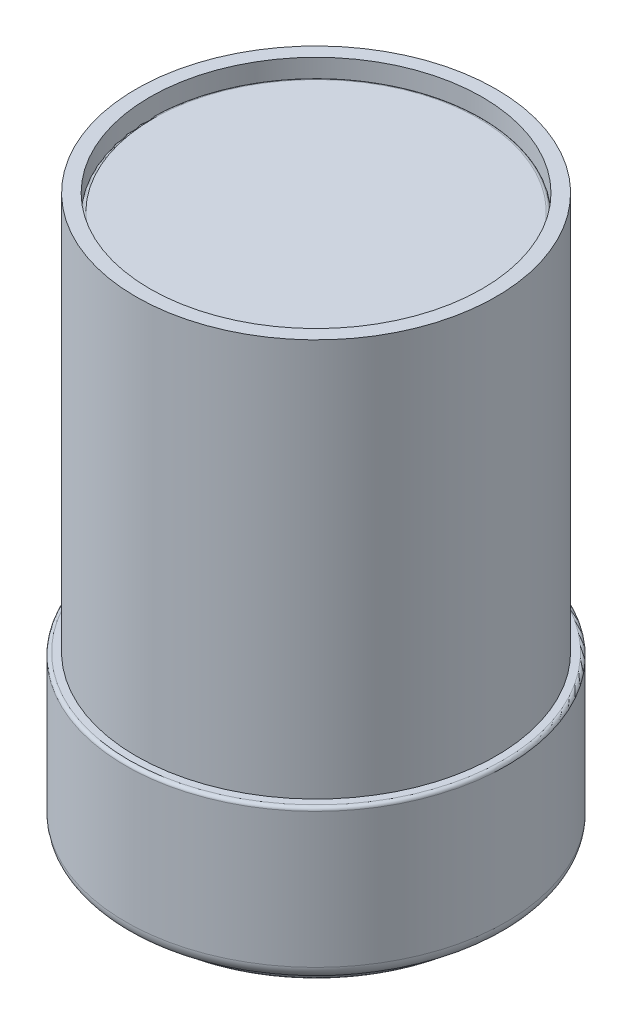
ISO-10303-21;
HEADER;
FILE_DESCRIPTION(('STEP AP214'),'2;1');
FILE_NAME('part.step','',(''),(''),'','','');
FILE_SCHEMA(('AUTOMOTIVE_DESIGN { 1 0 10303 214 1 1 1 1 }'));
ENDSEC;
DATA;
#1=APPLICATION_CONTEXT('core data for automotive mechanical design processes');
#2=APPLICATION_PROTOCOL_DEFINITION('international standard','automotive_design',2000,#1);
#3=PRODUCT_CONTEXT('',#1,'mechanical');
#4=PRODUCT('Part','Part','',(#3));
#5=PRODUCT_RELATED_PRODUCT_CATEGORY('part','',(#4));
#6=PRODUCT_DEFINITION_FORMATION('','',#4);
#7=PRODUCT_DEFINITION_CONTEXT('part definition',#1,'design');
#8=PRODUCT_DEFINITION('design','',#6,#7);
#9=PRODUCT_DEFINITION_SHAPE('','',#8);
#10=(LENGTH_UNIT() NAMED_UNIT(*) SI_UNIT(.MILLI.,.METRE.));
#11=(NAMED_UNIT(*) PLANE_ANGLE_UNIT() SI_UNIT($,.RADIAN.));
#12=(NAMED_UNIT(*) SI_UNIT($,.STERADIAN.) SOLID_ANGLE_UNIT());
#13=UNCERTAINTY_MEASURE_WITH_UNIT(LENGTH_MEASURE(1.E-05),#10,'distance_accuracy_value','');
#14=(GEOMETRIC_REPRESENTATION_CONTEXT(3) GLOBAL_UNCERTAINTY_ASSIGNED_CONTEXT((#13)) GLOBAL_UNIT_ASSIGNED_CONTEXT((#10,
#11,#12)) REPRESENTATION_CONTEXT('',''));
#15=CARTESIAN_POINT('',(0.,0.,0.));
#16=DIRECTION('',(0.,0.,1.));
#17=DIRECTION('',(1.,0.,0.));
#18=AXIS2_PLACEMENT_3D('',#15,#16,#17);
#19=CARTESIAN_POINT('',(0.,161.925,0.));
#20=DIRECTION('',(0.,-1.,0.));
#21=DIRECTION('',(0.,0.,-1.));
#22=AXIS2_PLACEMENT_3D('',#19,#20,#21);
#23=CYLINDRICAL_SURFACE('',#22,76.2);
#24=CARTESIAN_POINT('',(0.,160.401,0.));
#25=DIRECTION('',(0.,1.,0.));
#26=DIRECTION('',(0.,0.,1.));
#27=AXIS2_PLACEMENT_3D('',#24,#25,#26);
#28=CIRCLE('',#27,76.2);
#29=CARTESIAN_POINT('',(0.,160.401,-76.2));
#30=VERTEX_POINT('',#29);
#31=EDGE_CURVE('E11',#30,#30,#28,.F.);
#32=CARTESIAN_POINT('',(0.,-63.5000000000001,0.));
#33=DIRECTION('',(0.,1.,0.));
#34=DIRECTION('',(0.,0.,1.));
#35=AXIS2_PLACEMENT_3D('',#32,#33,#34);
#36=CIRCLE('',#35,76.2);
#37=CARTESIAN_POINT('',(0.,-63.5000000000001,-76.2));
#38=VERTEX_POINT('',#37);
#39=EDGE_CURVE('E53',#38,#38,#36,.T.);
#40=CARTESIAN_POINT('',(0.,160.401,-76.2));
#41=CARTESIAN_POINT('',(0.,158.068697916666,-76.2));
#42=CARTESIAN_POINT('',(0.,155.736395833333,-76.2));
#43=CARTESIAN_POINT('',(0.,151.071791666666,-76.2));
#44=CARTESIAN_POINT('',(0.,148.739489583333,-76.2));
#45=CARTESIAN_POINT('',(0.,144.074885416666,-76.2));
#46=CARTESIAN_POINT('',(0.,141.742583333333,-76.2));
#47=CARTESIAN_POINT('',(0.,137.077979166666,-76.2));
#48=CARTESIAN_POINT('',(0.,134.745677083333,-76.2));
#49=CARTESIAN_POINT('',(0.,130.081072916666,-76.2));
#50=CARTESIAN_POINT('',(0.,127.748770833333,-76.2));
#51=CARTESIAN_POINT('',(0.,123.084166666666,-76.2));
#52=CARTESIAN_POINT('',(0.,120.751864583333,-76.2));
#53=CARTESIAN_POINT('',(0.,116.087260416666,-76.2));
#54=CARTESIAN_POINT('',(0.,113.754958333333,-76.2));
#55=CARTESIAN_POINT('',(0.,109.090354166666,-76.2));
#56=CARTESIAN_POINT('',(0.,106.758052083333,-76.2));
#57=CARTESIAN_POINT('',(0.,102.093447916666,-76.2));
#58=CARTESIAN_POINT('',(0.,99.761145833333,-76.2));
#59=CARTESIAN_POINT('',(0.,95.0965416666663,-76.2));
#60=CARTESIAN_POINT('',(0.,92.764239583333,-76.2));
#61=CARTESIAN_POINT('',(0.,88.0996354166663,-76.2));
#62=CARTESIAN_POINT('',(0.,85.767333333333,-76.2));
#63=CARTESIAN_POINT('',(0.,81.1027291666664,-76.2));
#64=CARTESIAN_POINT('',(0.,78.770427083333,-76.2));
#65=CARTESIAN_POINT('',(0.,74.1058229166664,-76.2));
#66=CARTESIAN_POINT('',(0.,71.773520833333,-76.2));
#67=CARTESIAN_POINT('',(0.,67.1089166666664,-76.2));
#68=CARTESIAN_POINT('',(0.,64.776614583333,-76.2));
#69=CARTESIAN_POINT('',(0.,60.1120104166664,-76.2));
#70=CARTESIAN_POINT('',(0.,57.779708333333,-76.2));
#71=CARTESIAN_POINT('',(0.,53.1151041666664,-76.2));
#72=CARTESIAN_POINT('',(0.,50.7828020833331,-76.2));
#73=CARTESIAN_POINT('',(0.,46.1181979166664,-76.2));
#74=CARTESIAN_POINT('',(0.,43.7858958333331,-76.2));
#75=CARTESIAN_POINT('',(0.,39.1212916666664,-76.2));
#76=CARTESIAN_POINT('',(0.,36.7889895833331,-76.2));
#77=CARTESIAN_POINT('',(0.,32.1243854166664,-76.2));
#78=CARTESIAN_POINT('',(0.,29.7920833333331,-76.2));
#79=CARTESIAN_POINT('',(0.,25.1274791666665,-76.2));
#80=CARTESIAN_POINT('',(0.,22.7951770833331,-76.2));
#81=CARTESIAN_POINT('',(0.,18.1305729166665,-76.2));
#82=CARTESIAN_POINT('',(0.,15.7982708333331,-76.2));
#83=CARTESIAN_POINT('',(0.,11.1336666666665,-76.2));
#84=CARTESIAN_POINT('',(0.,8.80136458333315,-76.2));
#85=CARTESIAN_POINT('',(0.,4.13676041666649,-76.2));
#86=CARTESIAN_POINT('',(0.,1.80445833333316,-76.2));
#87=CARTESIAN_POINT('',(0.,-2.86014583333352,-76.2));
#88=CARTESIAN_POINT('',(0.,-5.19244791666687,-76.2));
#89=CARTESIAN_POINT('',(0.,-9.85705208333355,-76.2));
#90=CARTESIAN_POINT('',(0.,-12.1893541666669,-76.2));
#91=CARTESIAN_POINT('',(0.,-16.8539583333335,-76.2));
#92=CARTESIAN_POINT('',(0.,-19.1862604166669,-76.2));
#93=CARTESIAN_POINT('',(0.,-23.8508645833335,-76.2));
#94=CARTESIAN_POINT('',(0.,-26.1831666666669,-76.2));
#95=CARTESIAN_POINT('',(0.,-30.8477708333335,-76.2));
#96=CARTESIAN_POINT('',(0.,-33.1800729166669,-76.2));
#97=CARTESIAN_POINT('',(0.,-37.8446770833335,-76.2));
#98=CARTESIAN_POINT('',(0.,-40.1769791666668,-76.2));
#99=CARTESIAN_POINT('',(0.,-44.8415833333335,-76.2));
#100=CARTESIAN_POINT('',(0.,-47.1738854166668,-76.2));
#101=CARTESIAN_POINT('',(0.,-51.8384895833335,-76.2));
#102=CARTESIAN_POINT('',(0.,-54.1707916666668,-76.2));
#103=CARTESIAN_POINT('',(0.,-58.8353958333335,-76.2));
#104=CARTESIAN_POINT('',(0.,-61.1676979166668,-76.2));
#105=CARTESIAN_POINT('',(0.,-63.5000000000001,-76.2));
#106=B_SPLINE_CURVE_WITH_KNOTS('',3,(#40,#41,#42,#43,#44,#45,#46,#47,#48,#49,#50,#51,#52,#53,
#54,#55,#56,#57,#58,#59,#60,#61,#62,#63,#64,#65,#66,#67,#68,#69,#70,#71,#72,#73,#74,#75,#76,#77,
#78,#79,#80,#81,#82,#83,#84,#85,#86,#87,#88,#89,#90,#91,#92,#93,#94,#95,#96,#97,#98,#99,#100,
#101,#102,#103,#104,#105),.UNSPECIFIED.,.F.,.F.,(4,2,2,2,2,2,2,2,2,2,2,2,2,2,2,2,2,2,2,2,2,2,2,
2,2,2,2,2,2,2,2,2,4),(0.,6.99690625000002,13.9938125,20.99071875,27.987625,34.98453125,
41.9814375,48.97834375,55.9752499999999,62.9721562499999,69.9690624999999,76.9659687499999,
83.9628749999999,90.9597812499999,97.9566874999999,104.95359375,111.9505,118.94740625,
125.9443125,132.94121875,139.938125,146.93503125,153.9319375,160.92884375,167.92575,
174.92265625,181.9195625,188.91646875,195.913375,202.91028125,209.9071875,216.90409375,223.901),.UNSPECIFIED.);
#107=EDGE_CURVE('BSEAM42',#30,#38,#106,.T.);
#108=ORIENTED_EDGE('',*,*,#31,.T.);
#109=ORIENTED_EDGE('',*,*,#39,.T.);
#110=ORIENTED_EDGE('',*,*,#107,.T.);
#111=ORIENTED_EDGE('',*,*,#107,.F.);
#112=EDGE_LOOP('',(#108,#110,#109,#111));
#113=FACE_BOUND('',#112,.T.);
#114=ADVANCED_FACE('F42',(#113),#23,.T.);
#115=CARTESIAN_POINT('',(0.,161.925,0.));
#116=DIRECTION('',(0.,1.,0.));
#117=DIRECTION('',(0.,0.,1.));
#118=AXIS2_PLACEMENT_3D('',#115,#116,#117);
#119=PLANE('',#118);
#120=CARTESIAN_POINT('',(0.,161.925,0.));
#121=DIRECTION('',(0.,1.,0.));
#122=DIRECTION('',(0.,0.,1.));
#123=AXIS2_PLACEMENT_3D('',#120,#121,#122);
#124=CIRCLE('',#123,74.676);
#125=CARTESIAN_POINT('',(0.,161.925,74.676));
#126=VERTEX_POINT('',#125);
#127=EDGE_CURVE('E49',#126,#126,#124,.T.);
#128=ORIENTED_EDGE('',*,*,#127,.T.);
#129=EDGE_LOOP('',(#128));
#130=FACE_BOUND('',#129,.T.);
#131=ADVANCED_FACE('F63',(#130),#119,.T.);
#132=CARTESIAN_POINT('',(0.,-63.5000000000001,0.));
#133=DIRECTION('',(0.,1.,0.));
#134=DIRECTION('',(0.,0.,1.));
#135=AXIS2_PLACEMENT_3D('',#132,#133,#134);
#136=PLANE('',#135);
#137=ORIENTED_EDGE('',*,*,#39,.F.);
#138=EDGE_LOOP('',(#137));
#139=FACE_BOUND('',#138,.T.);
#140=ADVANCED_FACE('F61',(#139),#136,.F.);
#141=CARTESIAN_POINT('',(0.,160.401,0.));
#142=DIRECTION('',(0.,1.,0.));
#143=DIRECTION('',(0.,0.,1.));
#144=AXIS2_PLACEMENT_3D('',#141,#142,#143);
#145=TOROIDAL_SURFACE('',#144,74.676,1.52399999999999);
#146=ORIENTED_EDGE('',*,*,#31,.F.);
#147=EDGE_LOOP('',(#146));
#148=FACE_BOUND('',#147,.T.);
#149=ORIENTED_EDGE('',*,*,#127,.F.);
#150=EDGE_LOOP('',(#149));
#151=FACE_BOUND('',#150,.T.);
#152=ADVANCED_FACE('F44',(#148,#151),#145,.T.);
#153=CLOSED_SHELL('',(#114,#131,#140,#152));
#154=MANIFOLD_SOLID_BREP('B2',#153);
#155=CARTESIAN_POINT('',(0.,-12.7,0.));
#156=DIRECTION('',(0.,-1.,0.));
#157=DIRECTION('',(0.,0.,-1.));
#158=AXIS2_PLACEMENT_3D('',#155,#156,#157);
#159=CYLINDRICAL_SURFACE('',#158,87.3125);
#160=CARTESIAN_POINT('',(0.,-76.2000000000001,0.));
#161=DIRECTION('',(0.,-1.,0.));
#162=DIRECTION('',(0.,0.,-1.));
#163=AXIS2_PLACEMENT_3D('',#160,#161,#162);
#164=CIRCLE('',#163,87.3125);
#165=CARTESIAN_POINT('',(0.,-76.2000000000001,-87.3125));
#166=VERTEX_POINT('',#165);
#167=EDGE_CURVE('E131',#166,#166,#164,.F.);
#168=ORIENTED_EDGE('',*,*,#167,.T.);
#169=EDGE_LOOP('',(#168));
#170=FACE_BOUND('',#169,.T.);
#171=CARTESIAN_POINT('',(0.,-14.224,0.));
#172=DIRECTION('',(0.,-1.,0.));
#173=DIRECTION('',(0.,0.,-1.));
#174=AXIS2_PLACEMENT_3D('',#171,#172,#173);
#175=CIRCLE('',#174,87.3125);
#176=CARTESIAN_POINT('',(0.,-14.224,-87.3125));
#177=VERTEX_POINT('',#176);
#178=EDGE_CURVE('E143',#177,#177,#175,.T.);
#179=ORIENTED_EDGE('',*,*,#178,.T.);
#180=EDGE_LOOP('',(#179));
#181=FACE_BOUND('',#180,.T.);
#182=ADVANCED_FACE('F105',(#170,#181),#159,.T.);
#183=CARTESIAN_POINT('',(0.,-12.7,0.));
#184=DIRECTION('',(0.,-1.,0.));
#185=DIRECTION('',(0.,0.,-1.));
#186=AXIS2_PLACEMENT_3D('',#183,#184,#185);
#187=PLANE('',#186);
#188=CARTESIAN_POINT('',(0.,-12.7,0.));
#189=DIRECTION('',(0.,-1.,0.));
#190=DIRECTION('',(0.,0.,-1.));
#191=AXIS2_PLACEMENT_3D('',#188,#189,#190);
#192=CIRCLE('',#191,85.7885);
#193=CARTESIAN_POINT('',(0.,-12.7,-85.7885));
#194=VERTEX_POINT('',#193);
#195=EDGE_CURVE('E137',#194,#194,#192,.F.);
#196=ORIENTED_EDGE('',*,*,#195,.T.);
#197=EDGE_LOOP('',(#196));
#198=FACE_BOUND('',#197,.T.);
#199=CARTESIAN_POINT('',(0.,-12.7,0.));
#200=DIRECTION('',(0.,-1.,0.));
#201=DIRECTION('',(0.,0.,-1.));
#202=AXIS2_PLACEMENT_3D('',#199,#200,#201);
#203=CIRCLE('',#202,82.4865);
#204=CARTESIAN_POINT('',(0.,-12.7,-82.4865));
#205=VERTEX_POINT('',#204);
#206=EDGE_CURVE('E140',#205,#205,#203,.T.);
#207=ORIENTED_EDGE('',*,*,#206,.T.);
#208=EDGE_LOOP('',(#207));
#209=FACE_BOUND('',#208,.T.);
#210=ADVANCED_FACE('F163',(#198,#209),#187,.F.);
#211=CARTESIAN_POINT('',(0.,-12.7,0.));
#212=DIRECTION('',(0.,-1.,0.));
#213=DIRECTION('',(0.,0.,-1.));
#214=AXIS2_PLACEMENT_3D('',#211,#212,#213);
#215=CYLINDRICAL_SURFACE('',#214,80.9625);
#216=CARTESIAN_POINT('',(0.,-14.224,0.));
#217=DIRECTION('',(0.,-1.,0.));
#218=DIRECTION('',(0.,0.,-1.));
#219=AXIS2_PLACEMENT_3D('',#216,#217,#218);
#220=CIRCLE('',#219,80.9625);
#221=CARTESIAN_POINT('',(0.,-14.224,-80.9625));
#222=VERTEX_POINT('',#221);
#223=EDGE_CURVE('E134',#222,#222,#220,.F.);
#224=ORIENTED_EDGE('',*,*,#223,.T.);
#225=EDGE_LOOP('',(#224));
#226=FACE_BOUND('',#225,.T.);
#227=CARTESIAN_POINT('',(0.,-76.2000000000001,0.));
#228=DIRECTION('',(0.,-1.,0.));
#229=DIRECTION('',(0.,0.,-1.));
#230=AXIS2_PLACEMENT_3D('',#227,#228,#229);
#231=CIRCLE('',#230,80.9625);
#232=CARTESIAN_POINT('',(0.,-76.2000000000001,-80.9625));
#233=VERTEX_POINT('',#232);
#234=EDGE_CURVE('E146',#233,#233,#231,.T.);
#235=ORIENTED_EDGE('',*,*,#234,.T.);
#236=EDGE_LOOP('',(#235));
#237=FACE_BOUND('',#236,.T.);
#238=ADVANCED_FACE('F150',(#226,#237),#215,.F.);
#239=CARTESIAN_POINT('',(0.,-76.2000000000001,0.));
#240=DIRECTION('',(0.,-1.,0.));
#241=DIRECTION('',(0.,0.,-1.));
#242=AXIS2_PLACEMENT_3D('',#239,#240,#241);
#243=PLANE('',#242);
#244=ORIENTED_EDGE('',*,*,#234,.F.);
#245=EDGE_LOOP('',(#244));
#246=FACE_BOUND('',#245,.T.);
#247=ADVANCED_FACE('F152',(#246),#243,.F.);
#248=CARTESIAN_POINT('',(0.,-14.224,0.));
#249=DIRECTION('',(0.,-1.,0.));
#250=DIRECTION('',(0.,0.,-1.));
#251=AXIS2_PLACEMENT_3D('',#248,#249,#250);
#252=TOROIDAL_SURFACE('',#251,85.7885,1.524);
#253=ORIENTED_EDGE('',*,*,#195,.F.);
#254=EDGE_LOOP('',(#253));
#255=FACE_BOUND('',#254,.T.);
#256=ORIENTED_EDGE('',*,*,#178,.F.);
#257=EDGE_LOOP('',(#256));
#258=FACE_BOUND('',#257,.T.);
#259=ADVANCED_FACE('F154',(#255,#258),#252,.T.);
#260=CARTESIAN_POINT('',(0.,-14.224,0.));
#261=DIRECTION('',(0.,-1.,0.));
#262=DIRECTION('',(0.,0.,-1.));
#263=AXIS2_PLACEMENT_3D('',#260,#261,#262);
#264=TOROIDAL_SURFACE('',#263,82.4865,1.524);
#265=ORIENTED_EDGE('',*,*,#223,.F.);
#266=EDGE_LOOP('',(#265));
#267=FACE_BOUND('',#266,.T.);
#268=ORIENTED_EDGE('',*,*,#206,.F.);
#269=EDGE_LOOP('',(#268));
#270=FACE_BOUND('',#269,.T.);
#271=ADVANCED_FACE('F160',(#267,#270),#264,.T.);
#272=CARTESIAN_POINT('',(0.,-76.2000000000001,0.));
#273=DIRECTION('',(0.,-1.,0.));
#274=DIRECTION('',(0.,0.,-1.));
#275=AXIS2_PLACEMENT_3D('',#272,#273,#274);
#276=TOROIDAL_SURFACE('',#275,80.9625,6.35);
#277=CARTESIAN_POINT('',(0.,-82.5001953094789,0.));
#278=DIRECTION('',(0.,1.,0.));
#279=DIRECTION('',(0.,0.,1.));
#280=AXIS2_PLACEMENT_3D('',#277,#278,#279);
#281=CIRCLE('',#280,81.7562500000008);
#282=CARTESIAN_POINT('',(0.,-82.5001953094789,81.7562500000008));
#283=VERTEX_POINT('',#282);
#284=EDGE_CURVE('E125',#283,#283,#281,.T.);
#285=ORIENTED_EDGE('',*,*,#284,.T.);
#286=EDGE_LOOP('',(#285));
#287=FACE_BOUND('',#286,.T.);
#288=ORIENTED_EDGE('',*,*,#167,.F.);
#289=EDGE_LOOP('',(#288));
#290=FACE_BOUND('',#289,.T.);
#291=ADVANCED_FACE('F185',(#287,#290),#276,.T.);
#292=CARTESIAN_POINT('',(0.,-88.9000000000001,0.));
#293=DIRECTION('',(0.,-1.,0.));
#294=DIRECTION('',(0.,0.,-1.));
#295=AXIS2_PLACEMENT_3D('',#292,#293,#294);
#296=PLANE('',#295);
#297=CARTESIAN_POINT('',(0.,-88.9000000000001,0.));
#298=DIRECTION('',(0.,-1.,0.));
#299=DIRECTION('',(0.,0.,-1.));
#300=AXIS2_PLACEMENT_3D('',#297,#298,#299);
#301=CIRCLE('',#300,71.374);
#302=CARTESIAN_POINT('',(0.,-88.9000000000001,-71.374));
#303=VERTEX_POINT('',#302);
#304=EDGE_CURVE('E112',#303,#303,#301,.F.);
#305=ORIENTED_EDGE('',*,*,#304,.T.);
#306=EDGE_LOOP('',(#305));
#307=FACE_BOUND('',#306,.T.);
#308=CARTESIAN_POINT('',(0.,-88.9000000000001,0.));
#309=DIRECTION('',(0.,-1.,0.));
#310=DIRECTION('',(0.,0.,-1.));
#311=AXIS2_PLACEMENT_3D('',#308,#309,#310);
#312=CIRCLE('',#311,74.8059062915883);
#313=CARTESIAN_POINT('',(0.,-88.9000000000001,-74.8059062915883));
#314=VERTEX_POINT('',#313);
#315=EDGE_CURVE('E116',#314,#314,#312,.T.);
#316=ORIENTED_EDGE('',*,*,#315,.T.);
#317=EDGE_LOOP('',(#316));
#318=FACE_BOUND('',#317,.T.);
#319=ADVANCED_FACE('F189',(#307,#318),#296,.T.);
#320=CARTESIAN_POINT('',(0.,-88.9000000000001,0.));
#321=DIRECTION('',(0.,1.,0.));
#322=DIRECTION('',(0.,0.,1.));
#323=AXIS2_PLACEMENT_3D('',#320,#321,#322);
#324=CYLINDRICAL_SURFACE('',#323,69.85);
#325=CARTESIAN_POINT('',(0.,-87.3760000000001,0.));
#326=DIRECTION('',(0.,-1.,0.));
#327=DIRECTION('',(0.,0.,-1.));
#328=AXIS2_PLACEMENT_3D('',#325,#326,#327);
#329=CIRCLE('',#328,69.85);
#330=CARTESIAN_POINT('',(0.,-87.3760000000001,-69.85));
#331=VERTEX_POINT('',#330);
#332=EDGE_CURVE('E120',#331,#331,#329,.T.);
#333=ORIENTED_EDGE('',*,*,#332,.T.);
#334=EDGE_LOOP('',(#333));
#335=FACE_BOUND('',#334,.T.);
#336=CARTESIAN_POINT('',(0.,-82.5500000000001,0.));
#337=DIRECTION('',(0.,-1.,0.));
#338=DIRECTION('',(0.,0.,-1.));
#339=AXIS2_PLACEMENT_3D('',#336,#337,#338);
#340=CIRCLE('',#339,69.85);
#341=CARTESIAN_POINT('',(0.,-82.5500000000001,-69.85));
#342=VERTEX_POINT('',#341);
#343=EDGE_CURVE('E128',#342,#342,#340,.F.);
#344=ORIENTED_EDGE('',*,*,#343,.T.);
#345=EDGE_LOOP('',(#344));
#346=FACE_BOUND('',#345,.T.);
#347=ADVANCED_FACE('F180',(#335,#346),#324,.F.);
#348=CARTESIAN_POINT('',(0.,-82.5500000000001,0.));
#349=DIRECTION('',(0.,-1.,0.));
#350=DIRECTION('',(0.,0.,-1.));
#351=AXIS2_PLACEMENT_3D('',#348,#349,#350);
#352=PLANE('',#351);
#353=ORIENTED_EDGE('',*,*,#343,.F.);
#354=EDGE_LOOP('',(#353));
#355=FACE_BOUND('',#354,.T.);
#356=ADVANCED_FACE('F177',(#355),#352,.T.);
#357=CARTESIAN_POINT('',(0.,-88.8003906189452,0.));
#358=DIRECTION('',(0.,-1.,0.));
#359=DIRECTION('',(0.,0.,-1.));
#360=AXIS2_PLACEMENT_3D('',#357,#358,#359);
#361=TOROIDAL_SURFACE('',#360,82.55,6.35);
#362=CARTESIAN_POINT('',(0.,-87.6516885068927,0.));
#363=DIRECTION('',(0.,-1.,0.));
#364=DIRECTION('',(0.,0.,-1.));
#365=AXIS2_PLACEMENT_3D('',#362,#363,#364);
#366=CIRCLE('',#365,76.3047631383779);
#367=CARTESIAN_POINT('',(0.,-87.6516885068927,-76.3047631383779));
#368=VERTEX_POINT('',#367);
#369=EDGE_CURVE('E41',#368,#368,#366,.F.);
#370=ORIENTED_EDGE('',*,*,#369,.T.);
#371=EDGE_LOOP('',(#370));
#372=FACE_BOUND('',#371,.T.);
#373=ORIENTED_EDGE('',*,*,#284,.F.);
#374=EDGE_LOOP('',(#373));
#375=FACE_BOUND('',#374,.T.);
#376=ADVANCED_FACE('F179',(#372,#375),#361,.F.);
#377=CARTESIAN_POINT('',(0.,-87.3760000000001,0.));
#378=DIRECTION('',(0.,-1.,0.));
#379=DIRECTION('',(0.,0.,-1.));
#380=AXIS2_PLACEMENT_3D('',#377,#378,#379);
#381=TOROIDAL_SURFACE('',#380,71.374,1.524);
#382=ORIENTED_EDGE('',*,*,#304,.F.);
#383=EDGE_LOOP('',(#382));
#384=FACE_BOUND('',#383,.T.);
#385=ORIENTED_EDGE('',*,*,#332,.F.);
#386=EDGE_LOOP('',(#385));
#387=FACE_BOUND('',#386,.T.);
#388=ADVANCED_FACE('F192',(#384,#387),#381,.T.);
#389=CARTESIAN_POINT('',(0.,-87.3760000000001,0.));
#390=DIRECTION('',(0.,1.,0.));
#391=DIRECTION('',(0.,0.,1.));
#392=AXIS2_PLACEMENT_3D('',#389,#390,#391);
#393=TOROIDAL_SURFACE('',#392,74.8059062915883,1.524);
#394=ORIENTED_EDGE('',*,*,#369,.F.);
#395=EDGE_LOOP('',(#394));
#396=FACE_BOUND('',#395,.T.);
#397=ORIENTED_EDGE('',*,*,#315,.F.);
#398=EDGE_LOOP('',(#397));
#399=FACE_BOUND('',#398,.T.);
#400=ADVANCED_FACE('F107',(#396,#399),#393,.T.);
#401=CLOSED_SHELL('',(#182,#210,#238,#247,#259,#271,#291,#319,#347,#356,#376,#388,#400));
#402=MANIFOLD_SOLID_BREP('B6',#401);
#403=CARTESIAN_POINT('',(0.,-63.5000000000001,0.));
#404=DIRECTION('',(0.,1.,0.));
#405=DIRECTION('',(0.,0.,1.));
#406=AXIS2_PLACEMENT_3D('',#403,#404,#405);
#407=CYLINDRICAL_SURFACE('',#406,82.55);
#408=CARTESIAN_POINT('',(0.,-69.8500000000001,0.));
#409=DIRECTION('',(0.,1.,0.));
#410=DIRECTION('',(0.,0.,1.));
#411=AXIS2_PLACEMENT_3D('',#408,#409,#410);
#412=CIRCLE('',#411,82.55);
#413=CARTESIAN_POINT('',(0.,-69.8500000000001,82.55));
#414=VERTEX_POINT('',#413);
#415=EDGE_CURVE('E104',#414,#414,#412,.T.);
#416=ORIENTED_EDGE('',*,*,#415,.T.);
#417=EDGE_LOOP('',(#416));
#418=FACE_BOUND('',#417,.T.);
#419=CARTESIAN_POINT('',(0.,169.7,0.));
#420=DIRECTION('',(0.,1.,0.));
#421=DIRECTION('',(0.,0.,1.));
#422=AXIS2_PLACEMENT_3D('',#419,#420,#421);
#423=CIRCLE('',#422,82.55);
#424=CARTESIAN_POINT('',(0.,169.7,82.55));
#425=VERTEX_POINT('',#424);
#426=EDGE_CURVE('E300',#425,#425,#423,.T.);
#427=ORIENTED_EDGE('',*,*,#426,.F.);
#428=EDGE_LOOP('',(#427));
#429=FACE_BOUND('',#428,.T.);
#430=ADVANCED_FACE('F296',(#418,#429),#407,.T.);
#431=CARTESIAN_POINT('',(0.,-69.8500000000001,0.));
#432=DIRECTION('',(0.,1.,0.));
#433=DIRECTION('',(0.,0.,1.));
#434=AXIS2_PLACEMENT_3D('',#431,#432,#433);
#435=PLANE('',#434);
#436=ORIENTED_EDGE('',*,*,#415,.F.);
#437=EDGE_LOOP('',(#436));
#438=FACE_BOUND('',#437,.T.);
#439=ADVANCED_FACE('F298',(#438),#435,.F.);
#440=CARTESIAN_POINT('',(0.,169.7,0.));
#441=DIRECTION('',(0.,1.,0.));
#442=DIRECTION('',(0.,0.,1.));
#443=AXIS2_PLACEMENT_3D('',#440,#441,#442);
#444=PLANE('',#443);
#445=CARTESIAN_POINT('',(0.,169.7,0.));
#446=DIRECTION('',(0.,1.,0.));
#447=DIRECTION('',(0.,0.,1.));
#448=AXIS2_PLACEMENT_3D('',#445,#446,#447);
#449=CIRCLE('',#448,76.2);
#450=CARTESIAN_POINT('',(0.,169.7,76.2));
#451=VERTEX_POINT('',#450);
#452=EDGE_CURVE('E311',#451,#451,#449,.T.);
#453=ORIENTED_EDGE('',*,*,#452,.F.);
#454=EDGE_LOOP('',(#453));
#455=FACE_BOUND('',#454,.T.);
#456=ORIENTED_EDGE('',*,*,#426,.T.);
#457=EDGE_LOOP('',(#456));
#458=FACE_BOUND('',#457,.T.);
#459=ADVANCED_FACE('F317',(#455,#458),#444,.T.);
#460=CARTESIAN_POINT('',(0.,-63.5000000000001,0.));
#461=DIRECTION('',(0.,1.,0.));
#462=DIRECTION('',(0.,0.,1.));
#463=AXIS2_PLACEMENT_3D('',#460,#461,#462);
#464=CYLINDRICAL_SURFACE('',#463,76.2);
#465=CARTESIAN_POINT('',(0.,-63.5000000000001,0.));
#466=DIRECTION('',(0.,1.,0.));
#467=DIRECTION('',(0.,0.,1.));
#468=AXIS2_PLACEMENT_3D('',#465,#466,#467);
#469=CIRCLE('',#468,76.2);
#470=CARTESIAN_POINT('',(0.,-63.5000000000001,76.2));
#471=VERTEX_POINT('',#470);
#472=EDGE_CURVE('E307',#471,#471,#469,.T.);
#473=ORIENTED_EDGE('',*,*,#472,.F.);
#474=EDGE_LOOP('',(#473));
#475=FACE_BOUND('',#474,.T.);
#476=ORIENTED_EDGE('',*,*,#452,.T.);
#477=EDGE_LOOP('',(#476));
#478=FACE_BOUND('',#477,.T.);
#479=ADVANCED_FACE('F315',(#475,#478),#464,.F.);
#480=CARTESIAN_POINT('',(0.,-63.5000000000001,0.));
#481=DIRECTION('',(0.,1.,0.));
#482=DIRECTION('',(0.,0.,1.));
#483=AXIS2_PLACEMENT_3D('',#480,#481,#482);
#484=PLANE('',#483);
#485=ORIENTED_EDGE('',*,*,#472,.T.);
#486=EDGE_LOOP('',(#485));
#487=FACE_BOUND('',#486,.T.);
#488=ADVANCED_FACE('F331',(#487),#484,.T.);
#489=CLOSED_SHELL('',(#430,#439,#459,#479,#488));
#490=MANIFOLD_SOLID_BREP('B36',#489);
#491=ADVANCED_BREP_SHAPE_REPRESENTATION('',(#18,#154,#402,#490),#14);
#492=SHAPE_DEFINITION_REPRESENTATION(#9,#491);
ENDSEC;
END-ISO-10303-21;
